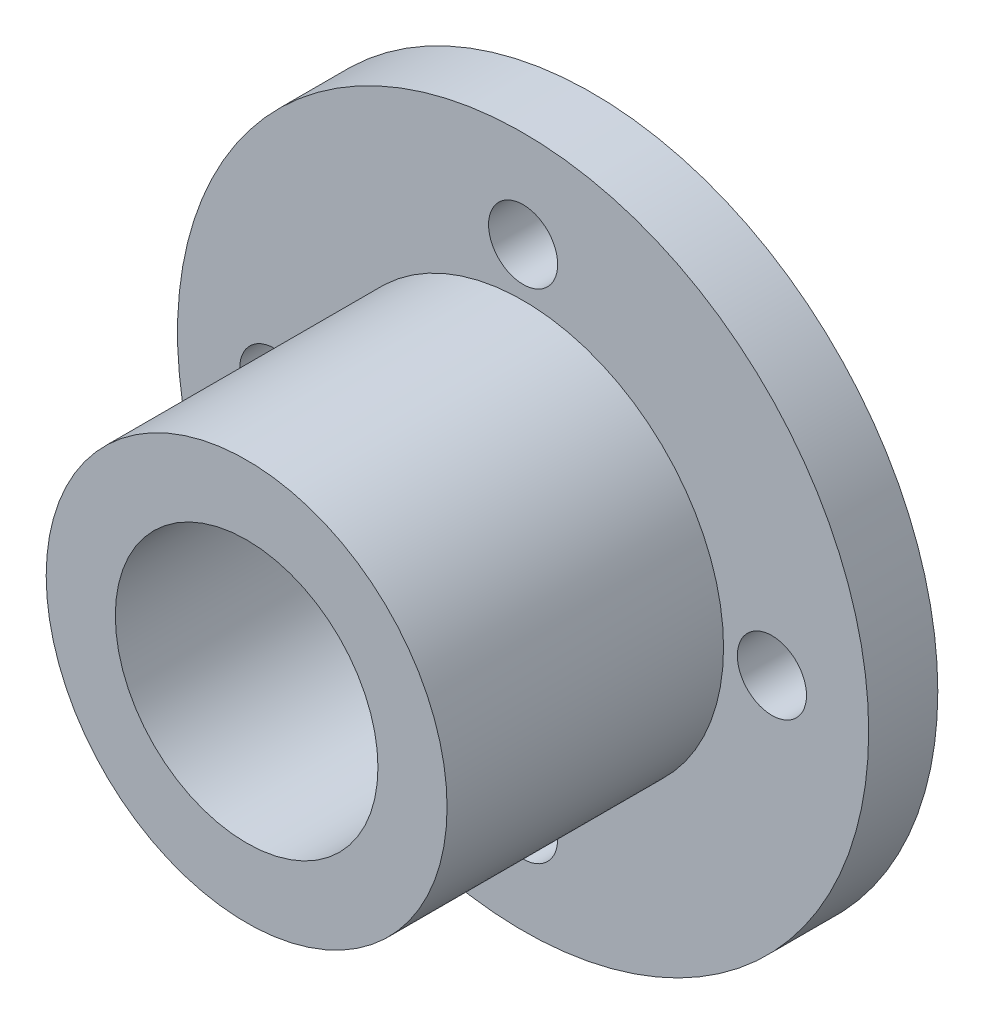
ISO-10303-21;
HEADER;
FILE_DESCRIPTION(('STEP AP214'),'2;1');
FILE_NAME('part.step','',(''),(''),'','','');
FILE_SCHEMA(('AUTOMOTIVE_DESIGN { 1 0 10303 214 1 1 1 1 }'));
ENDSEC;
DATA;
#1=APPLICATION_CONTEXT('core data for automotive mechanical design processes');
#2=APPLICATION_PROTOCOL_DEFINITION('international standard','automotive_design',2000,#1);
#3=PRODUCT_CONTEXT('',#1,'mechanical');
#4=PRODUCT('Part','Part','',(#3));
#5=PRODUCT_RELATED_PRODUCT_CATEGORY('part','',(#4));
#6=PRODUCT_DEFINITION_FORMATION('','',#4);
#7=PRODUCT_DEFINITION_CONTEXT('part definition',#1,'design');
#8=PRODUCT_DEFINITION('design','',#6,#7);
#9=PRODUCT_DEFINITION_SHAPE('','',#8);
#10=(LENGTH_UNIT() NAMED_UNIT(*) SI_UNIT(.MILLI.,.METRE.));
#11=(NAMED_UNIT(*) PLANE_ANGLE_UNIT() SI_UNIT($,.RADIAN.));
#12=(NAMED_UNIT(*) SI_UNIT($,.STERADIAN.) SOLID_ANGLE_UNIT());
#13=UNCERTAINTY_MEASURE_WITH_UNIT(LENGTH_MEASURE(1.E-05),#10,'distance_accuracy_value','');
#14=(GEOMETRIC_REPRESENTATION_CONTEXT(3) GLOBAL_UNCERTAINTY_ASSIGNED_CONTEXT((#13)) GLOBAL_UNIT_ASSIGNED_CONTEXT((#10,
#11,#12)) REPRESENTATION_CONTEXT('',''));
#15=CARTESIAN_POINT('',(0.,0.,0.));
#16=DIRECTION('',(0.,0.,1.));
#17=DIRECTION('',(1.,0.,0.));
#18=AXIS2_PLACEMENT_3D('',#15,#16,#17);
#19=CARTESIAN_POINT('',(0.,0.,5.));
#20=DIRECTION('',(0.,0.,-1.));
#21=DIRECTION('',(-1.,0.,0.));
#22=AXIS2_PLACEMENT_3D('',#19,#20,#21);
#23=CYLINDRICAL_SURFACE('',#22,25.);
#24=CARTESIAN_POINT('',(0.,0.,5.));
#25=DIRECTION('',(0.,0.,1.));
#26=DIRECTION('',(1.,0.,0.));
#27=AXIS2_PLACEMENT_3D('',#24,#25,#26);
#28=CIRCLE('',#27,25.);
#29=CARTESIAN_POINT('',(25.,0.,5.));
#30=VERTEX_POINT('',#29);
#31=EDGE_CURVE('E10',#30,#30,#28,.T.);
#32=ORIENTED_EDGE('',*,*,#31,.F.);
#33=EDGE_LOOP('',(#32));
#34=FACE_BOUND('',#33,.T.);
#35=CARTESIAN_POINT('',(0.,0.,0.));
#36=DIRECTION('',(0.,0.,1.));
#37=DIRECTION('',(1.,0.,0.));
#38=AXIS2_PLACEMENT_3D('',#35,#36,#37);
#39=CIRCLE('',#38,25.);
#40=CARTESIAN_POINT('',(25.,0.,0.));
#41=VERTEX_POINT('',#40);
#42=EDGE_CURVE('E37',#41,#41,#39,.T.);
#43=ORIENTED_EDGE('',*,*,#42,.T.);
#44=EDGE_LOOP('',(#43));
#45=FACE_BOUND('',#44,.T.);
#46=ADVANCED_FACE('F34',(#34,#45),#23,.T.);
#47=CARTESIAN_POINT('',(0.,0.,5.));
#48=DIRECTION('',(0.,0.,1.));
#49=DIRECTION('',(1.,0.,0.));
#50=AXIS2_PLACEMENT_3D('',#47,#48,#49);
#51=PLANE('',#50);
#52=CARTESIAN_POINT('',(0.,18.,5.));
#53=DIRECTION('',(0.,0.,1.));
#54=DIRECTION('',(1.,0.,0.));
#55=AXIS2_PLACEMENT_3D('',#52,#53,#54);
#56=CIRCLE('',#55,2.5);
#57=CARTESIAN_POINT('',(2.5,18.,5.));
#58=VERTEX_POINT('',#57);
#59=EDGE_CURVE('E57',#58,#58,#56,.T.);
#60=ORIENTED_EDGE('',*,*,#59,.F.);
#61=EDGE_LOOP('',(#60));
#62=FACE_BOUND('',#61,.T.);
#63=CARTESIAN_POINT('',(-18.,0.,5.));
#64=DIRECTION('',(0.,0.,1.));
#65=DIRECTION('',(1.,0.,0.));
#66=AXIS2_PLACEMENT_3D('',#63,#64,#65);
#67=CIRCLE('',#66,2.5);
#68=CARTESIAN_POINT('',(-15.5,0.,5.));
#69=VERTEX_POINT('',#68);
#70=EDGE_CURVE('E60',#69,#69,#67,.T.);
#71=ORIENTED_EDGE('',*,*,#70,.F.);
#72=EDGE_LOOP('',(#71));
#73=FACE_BOUND('',#72,.T.);
#74=CARTESIAN_POINT('',(-5.07182041270342E-13,-18.,5.));
#75=DIRECTION('',(0.,0.,1.));
#76=DIRECTION('',(1.,0.,0.));
#77=AXIS2_PLACEMENT_3D('',#74,#75,#76);
#78=CIRCLE('',#77,2.5000000000006);
#79=CARTESIAN_POINT('',(2.5000000000001,-18.,5.));
#80=VERTEX_POINT('',#79);
#81=EDGE_CURVE('E63',#80,#80,#78,.T.);
#82=ORIENTED_EDGE('',*,*,#81,.F.);
#83=EDGE_LOOP('',(#82));
#84=FACE_BOUND('',#83,.T.);
#85=CARTESIAN_POINT('',(17.9999999999997,-2.55795384873636E-13,5.));
#86=DIRECTION('',(0.,0.,1.));
#87=DIRECTION('',(1.,0.,0.));
#88=AXIS2_PLACEMENT_3D('',#85,#86,#87);
#89=CIRCLE('',#88,2.5000000000005);
#90=CARTESIAN_POINT('',(20.5000000000002,-2.55795384873636E-13,5.));
#91=VERTEX_POINT('',#90);
#92=EDGE_CURVE('E66',#91,#91,#89,.T.);
#93=ORIENTED_EDGE('',*,*,#92,.F.);
#94=EDGE_LOOP('',(#93));
#95=FACE_BOUND('',#94,.T.);
#96=CARTESIAN_POINT('',(0.,0.,5.));
#97=DIRECTION('',(0.,0.,1.));
#98=DIRECTION('',(1.,0.,0.));
#99=AXIS2_PLACEMENT_3D('',#96,#97,#98);
#100=CIRCLE('',#99,14.5);
#101=CARTESIAN_POINT('',(14.5,0.,5.));
#102=VERTEX_POINT('',#101);
#103=EDGE_CURVE('E46',#102,#102,#100,.T.);
#104=ORIENTED_EDGE('',*,*,#103,.F.);
#105=EDGE_LOOP('',(#104));
#106=FACE_BOUND('',#105,.T.);
#107=ORIENTED_EDGE('',*,*,#31,.T.);
#108=EDGE_LOOP('',(#107));
#109=FACE_BOUND('',#108,.T.);
#110=ADVANCED_FACE('F88',(#62,#73,#84,#95,#106,#109),#51,.T.);
#111=CARTESIAN_POINT('',(0.,0.,0.));
#112=DIRECTION('',(0.,0.,1.));
#113=DIRECTION('',(1.,0.,0.));
#114=AXIS2_PLACEMENT_3D('',#111,#112,#113);
#115=PLANE('',#114);
#116=CARTESIAN_POINT('',(0.,18.,0.));
#117=DIRECTION('',(0.,0.,-1.));
#118=DIRECTION('',(-1.,0.,0.));
#119=AXIS2_PLACEMENT_3D('',#116,#117,#118);
#120=CIRCLE('',#119,2.5);
#121=CARTESIAN_POINT('',(-2.5,18.,0.));
#122=VERTEX_POINT('',#121);
#123=EDGE_CURVE('E69',#122,#122,#120,.T.);
#124=ORIENTED_EDGE('',*,*,#123,.F.);
#125=EDGE_LOOP('',(#124));
#126=FACE_BOUND('',#125,.T.);
#127=CARTESIAN_POINT('',(-18.,0.,0.));
#128=DIRECTION('',(0.,0.,-1.));
#129=DIRECTION('',(-1.,0.,0.));
#130=AXIS2_PLACEMENT_3D('',#127,#128,#129);
#131=CIRCLE('',#130,2.5);
#132=CARTESIAN_POINT('',(-20.5,0.,0.));
#133=VERTEX_POINT('',#132);
#134=EDGE_CURVE('E76',#133,#133,#131,.T.);
#135=ORIENTED_EDGE('',*,*,#134,.F.);
#136=EDGE_LOOP('',(#135));
#137=FACE_BOUND('',#136,.T.);
#138=CARTESIAN_POINT('',(-5.07182041270342E-13,-18.,0.));
#139=DIRECTION('',(0.,0.,-1.));
#140=DIRECTION('',(-1.,0.,0.));
#141=AXIS2_PLACEMENT_3D('',#138,#139,#140);
#142=CIRCLE('',#141,2.5000000000006);
#143=CARTESIAN_POINT('',(-2.50000000000111,-18.,0.));
#144=VERTEX_POINT('',#143);
#145=EDGE_CURVE('E73',#144,#144,#142,.T.);
#146=ORIENTED_EDGE('',*,*,#145,.F.);
#147=EDGE_LOOP('',(#146));
#148=FACE_BOUND('',#147,.T.);
#149=CARTESIAN_POINT('',(17.9999999999997,-2.55795384873636E-13,0.));
#150=DIRECTION('',(0.,0.,-1.));
#151=DIRECTION('',(-1.,0.,0.));
#152=AXIS2_PLACEMENT_3D('',#149,#150,#151);
#153=CIRCLE('',#152,2.5000000000005);
#154=CARTESIAN_POINT('',(15.4999999999992,-2.55795384873636E-13,0.));
#155=VERTEX_POINT('',#154);
#156=EDGE_CURVE('E70',#155,#155,#153,.T.);
#157=ORIENTED_EDGE('',*,*,#156,.F.);
#158=EDGE_LOOP('',(#157));
#159=FACE_BOUND('',#158,.T.);
#160=CARTESIAN_POINT('',(0.,0.,0.));
#161=DIRECTION('',(0.,0.,-1.));
#162=DIRECTION('',(-1.,0.,0.));
#163=AXIS2_PLACEMENT_3D('',#160,#161,#162);
#164=CIRCLE('',#163,9.5);
#165=CARTESIAN_POINT('',(-9.5,0.,0.));
#166=VERTEX_POINT('',#165);
#167=EDGE_CURVE('E54',#166,#166,#164,.T.);
#168=ORIENTED_EDGE('',*,*,#167,.F.);
#169=EDGE_LOOP('',(#168));
#170=FACE_BOUND('',#169,.T.);
#171=ORIENTED_EDGE('',*,*,#42,.F.);
#172=EDGE_LOOP('',(#171));
#173=FACE_BOUND('',#172,.T.);
#174=ADVANCED_FACE('F84',(#126,#137,#148,#159,#170,#173),#115,.F.);
#175=CARTESIAN_POINT('',(0.,0.,25.));
#176=DIRECTION('',(0.,0.,1.));
#177=DIRECTION('',(1.,0.,0.));
#178=AXIS2_PLACEMENT_3D('',#175,#176,#177);
#179=PLANE('',#178);
#180=CARTESIAN_POINT('',(0.,0.,25.));
#181=DIRECTION('',(0.,0.,1.));
#182=DIRECTION('',(1.,0.,0.));
#183=AXIS2_PLACEMENT_3D('',#180,#181,#182);
#184=CIRCLE('',#183,14.5);
#185=CARTESIAN_POINT('',(14.5,0.,25.));
#186=VERTEX_POINT('',#185);
#187=EDGE_CURVE('E44',#186,#186,#184,.T.);
#188=ORIENTED_EDGE('',*,*,#187,.T.);
#189=EDGE_LOOP('',(#188));
#190=FACE_BOUND('',#189,.T.);
#191=CARTESIAN_POINT('',(0.,0.,25.));
#192=DIRECTION('',(0.,0.,1.));
#193=DIRECTION('',(1.,0.,0.));
#194=AXIS2_PLACEMENT_3D('',#191,#192,#193);
#195=CIRCLE('',#194,9.5);
#196=CARTESIAN_POINT('',(9.5,0.,25.));
#197=VERTEX_POINT('',#196);
#198=EDGE_CURVE('E49',#197,#197,#195,.T.);
#199=ORIENTED_EDGE('',*,*,#198,.F.);
#200=EDGE_LOOP('',(#199));
#201=FACE_BOUND('',#200,.T.);
#202=ADVANCED_FACE('F87',(#190,#201),#179,.T.);
#203=CARTESIAN_POINT('',(0.,0.,25.));
#204=DIRECTION('',(0.,0.,-1.));
#205=DIRECTION('',(-1.,0.,0.));
#206=AXIS2_PLACEMENT_3D('',#203,#204,#205);
#207=CYLINDRICAL_SURFACE('',#206,14.5);
#208=ORIENTED_EDGE('',*,*,#187,.F.);
#209=EDGE_LOOP('',(#208));
#210=FACE_BOUND('',#209,.T.);
#211=ORIENTED_EDGE('',*,*,#103,.T.);
#212=EDGE_LOOP('',(#211));
#213=FACE_BOUND('',#212,.T.);
#214=ADVANCED_FACE('F111',(#210,#213),#207,.T.);
#215=CARTESIAN_POINT('',(0.,0.,25.));
#216=DIRECTION('',(0.,0.,-1.));
#217=DIRECTION('',(-1.,0.,0.));
#218=AXIS2_PLACEMENT_3D('',#215,#216,#217);
#219=CYLINDRICAL_SURFACE('',#218,9.5);
#220=ORIENTED_EDGE('',*,*,#167,.T.);
#221=EDGE_LOOP('',(#220));
#222=FACE_BOUND('',#221,.T.);
#223=ORIENTED_EDGE('',*,*,#198,.T.);
#224=EDGE_LOOP('',(#223));
#225=FACE_BOUND('',#224,.T.);
#226=ADVANCED_FACE('F114',(#222,#225),#219,.F.);
#227=CARTESIAN_POINT('',(17.9999999999997,-2.55795384873636E-13,10.));
#228=DIRECTION('',(0.,0.,-1.));
#229=DIRECTION('',(-1.,0.,0.));
#230=AXIS2_PLACEMENT_3D('',#227,#228,#229);
#231=CYLINDRICAL_SURFACE('',#230,2.5000000000005);
#232=ORIENTED_EDGE('',*,*,#92,.T.);
#233=EDGE_LOOP('',(#232));
#234=FACE_BOUND('',#233,.T.);
#235=ORIENTED_EDGE('',*,*,#156,.T.);
#236=EDGE_LOOP('',(#235));
#237=FACE_BOUND('',#236,.T.);
#238=ADVANCED_FACE('F121',(#234,#237),#231,.F.);
#239=CARTESIAN_POINT('',(-5.07182041270342E-13,-18.,10.));
#240=DIRECTION('',(0.,0.,-1.));
#241=DIRECTION('',(-1.,0.,0.));
#242=AXIS2_PLACEMENT_3D('',#239,#240,#241);
#243=CYLINDRICAL_SURFACE('',#242,2.5000000000006);
#244=ORIENTED_EDGE('',*,*,#81,.T.);
#245=EDGE_LOOP('',(#244));
#246=FACE_BOUND('',#245,.T.);
#247=ORIENTED_EDGE('',*,*,#145,.T.);
#248=EDGE_LOOP('',(#247));
#249=FACE_BOUND('',#248,.T.);
#250=ADVANCED_FACE('F125',(#246,#249),#243,.F.);
#251=CARTESIAN_POINT('',(-18.,0.,10.));
#252=DIRECTION('',(0.,0.,-1.));
#253=DIRECTION('',(-1.,0.,0.));
#254=AXIS2_PLACEMENT_3D('',#251,#252,#253);
#255=CYLINDRICAL_SURFACE('',#254,2.5);
#256=ORIENTED_EDGE('',*,*,#70,.T.);
#257=EDGE_LOOP('',(#256));
#258=FACE_BOUND('',#257,.T.);
#259=ORIENTED_EDGE('',*,*,#134,.T.);
#260=EDGE_LOOP('',(#259));
#261=FACE_BOUND('',#260,.T.);
#262=ADVANCED_FACE('F129',(#258,#261),#255,.F.);
#263=CARTESIAN_POINT('',(0.,18.,10.));
#264=DIRECTION('',(0.,0.,-1.));
#265=DIRECTION('',(-1.,0.,0.));
#266=AXIS2_PLACEMENT_3D('',#263,#264,#265);
#267=CYLINDRICAL_SURFACE('',#266,2.5);
#268=ORIENTED_EDGE('',*,*,#59,.T.);
#269=EDGE_LOOP('',(#268));
#270=FACE_BOUND('',#269,.T.);
#271=ORIENTED_EDGE('',*,*,#123,.T.);
#272=EDGE_LOOP('',(#271));
#273=FACE_BOUND('',#272,.T.);
#274=ADVANCED_FACE('F82',(#270,#273),#267,.F.);
#275=CLOSED_SHELL('',(#46,#110,#174,#202,#214,#226,#238,#250,#262,#274));
#276=MANIFOLD_SOLID_BREP('B2',#275);
#277=ADVANCED_BREP_SHAPE_REPRESENTATION('',(#18,#276),#14);
#278=SHAPE_DEFINITION_REPRESENTATION(#9,#277);
ENDSEC;
END-ISO-10303-21;
